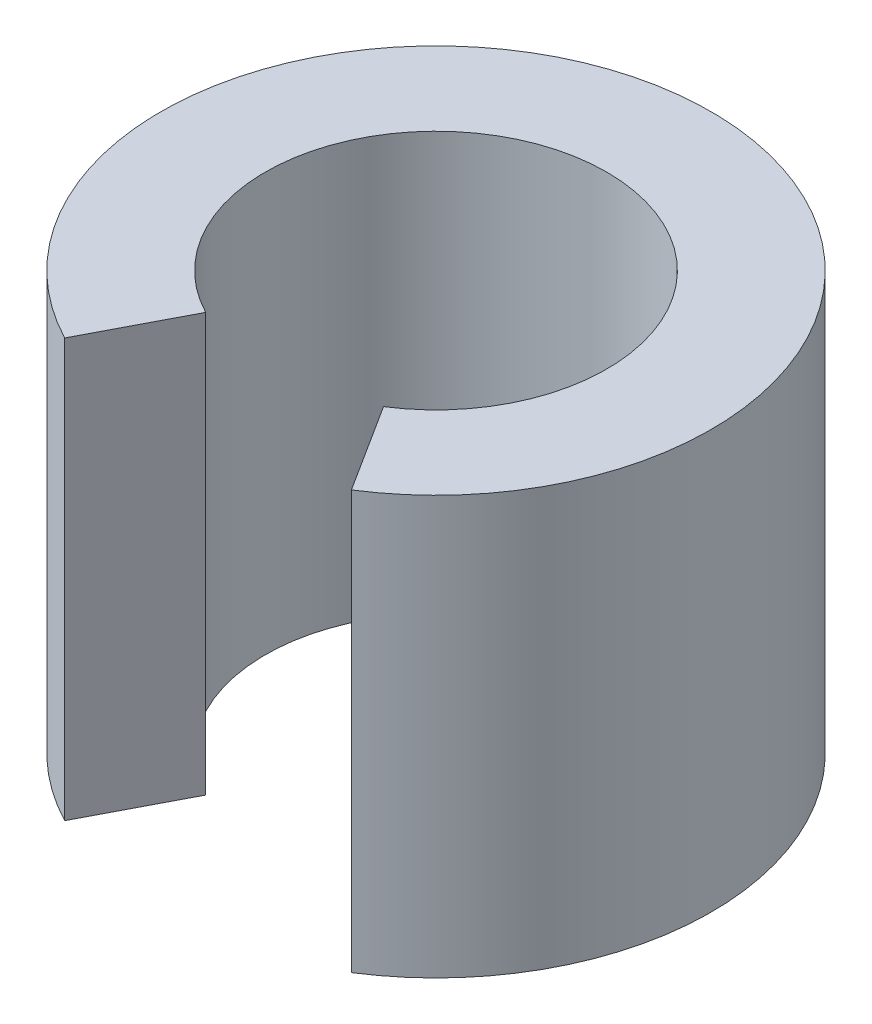
ISO-10303-21;
HEADER;
FILE_DESCRIPTION(('STEP AP214'),'2;1');
FILE_NAME('part.step','',(''),(''),'','','');
FILE_SCHEMA(('AUTOMOTIVE_DESIGN { 1 0 10303 214 1 1 1 1 }'));
ENDSEC;
DATA;
#1=APPLICATION_CONTEXT('core data for automotive mechanical design processes');
#2=APPLICATION_PROTOCOL_DEFINITION('international standard','automotive_design',2000,#1);
#3=PRODUCT_CONTEXT('',#1,'mechanical');
#4=PRODUCT('Part','Part','',(#3));
#5=PRODUCT_RELATED_PRODUCT_CATEGORY('part','',(#4));
#6=PRODUCT_DEFINITION_FORMATION('','',#4);
#7=PRODUCT_DEFINITION_CONTEXT('part definition',#1,'design');
#8=PRODUCT_DEFINITION('design','',#6,#7);
#9=PRODUCT_DEFINITION_SHAPE('','',#8);
#10=(LENGTH_UNIT() NAMED_UNIT(*) SI_UNIT(.MILLI.,.METRE.));
#11=(NAMED_UNIT(*) PLANE_ANGLE_UNIT() SI_UNIT($,.RADIAN.));
#12=(NAMED_UNIT(*) SI_UNIT($,.STERADIAN.) SOLID_ANGLE_UNIT());
#13=UNCERTAINTY_MEASURE_WITH_UNIT(LENGTH_MEASURE(1.E-05),#10,'distance_accuracy_value','');
#14=(GEOMETRIC_REPRESENTATION_CONTEXT(3) GLOBAL_UNCERTAINTY_ASSIGNED_CONTEXT((#13)) GLOBAL_UNIT_ASSIGNED_CONTEXT((#10,
#11,#12)) REPRESENTATION_CONTEXT('',''));
#15=CARTESIAN_POINT('',(0.,0.,0.));
#16=DIRECTION('',(0.,0.,1.));
#17=DIRECTION('',(1.,0.,0.));
#18=AXIS2_PLACEMENT_3D('',#15,#16,#17);
#19=CARTESIAN_POINT('',(0.,6.,0.));
#20=DIRECTION('',(0.,-1.,0.));
#21=DIRECTION('',(0.,0.,-1.));
#22=AXIS2_PLACEMENT_3D('',#19,#20,#21);
#23=CYLINDRICAL_SURFACE('',#22,2.45);
#24=CARTESIAN_POINT('',(0.,0.,0.));
#25=DIRECTION('',(0.,-1.,0.));
#26=DIRECTION('',(0.,0.,-1.));
#27=AXIS2_PLACEMENT_3D('',#24,#25,#26);
#28=CIRCLE('',#27,2.45);
#29=CARTESIAN_POINT('',(-1.1332867164028,0.,2.17213287310536));
#30=VERTEX_POINT('',#29);
#31=CARTESIAN_POINT('',(1.3144788903031,0.,2.06752152272897));
#32=VERTEX_POINT('',#31);
#33=EDGE_CURVE('E96',#30,#32,#28,.T.);
#34=ORIENTED_EDGE('',*,*,#33,.T.);
#35=DIRECTION('',(0.,-1.,0.));
#36=VECTOR('',#35,1.);
#37=CARTESIAN_POINT('',(1.3144788903031,6.,2.06752152272897));
#38=LINE('',#37,#36);
#39=CARTESIAN_POINT('',(1.3144788903031,6.,2.06752152272897));
#40=VERTEX_POINT('',#39);
#41=EDGE_CURVE('E11',#40,#32,#38,.T.);
#42=ORIENTED_EDGE('',*,*,#41,.F.);
#43=CARTESIAN_POINT('',(0.,6.,0.));
#44=DIRECTION('',(0.,-1.,0.));
#45=DIRECTION('',(0.,0.,-1.));
#46=AXIS2_PLACEMENT_3D('',#43,#44,#45);
#47=CIRCLE('',#46,2.45);
#48=CARTESIAN_POINT('',(-1.1332867164028,6.,2.17213287310536));
#49=VERTEX_POINT('',#48);
#50=EDGE_CURVE('E84',#49,#40,#47,.T.);
#51=ORIENTED_EDGE('',*,*,#50,.F.);
#52=DIRECTION('',(0.,-1.,0.));
#53=VECTOR('',#52,1.);
#54=CARTESIAN_POINT('',(-1.1332867164028,6.,2.17213287310536));
#55=LINE('',#54,#53);
#56=EDGE_CURVE('E92',#49,#30,#55,.T.);
#57=ORIENTED_EDGE('',*,*,#56,.T.);
#58=EDGE_LOOP('',(#34,#42,#51,#57));
#59=FACE_BOUND('',#58,.T.);
#60=ADVANCED_FACE('F33',(#59),#23,.F.);
#61=CARTESIAN_POINT('',(1.3144788903031,6.,2.06752152272897));
#62=DIRECTION('',(0.843886335807745,0.,-0.53652199604208));
#63=DIRECTION('',(-0.53652199604208,0.,-0.843886335807745));
#64=AXIS2_PLACEMENT_3D('',#61,#62,#63);
#65=PLANE('',#64);
#66=DIRECTION('',(0.53652199604208,0.,0.843886335807745));
#67=VECTOR('',#66,1.);
#68=CARTESIAN_POINT('',(1.3144788903031,0.,2.06752152272897));
#69=LINE('',#68,#67);
#70=CARTESIAN_POINT('',(2.11926188436622,0.,3.33335102644059));
#71=VERTEX_POINT('',#70);
#72=EDGE_CURVE('E88',#32,#71,#69,.T.);
#73=ORIENTED_EDGE('',*,*,#72,.T.);
#74=DIRECTION('',(0.,-1.,0.));
#75=VECTOR('',#74,1.);
#76=CARTESIAN_POINT('',(2.11926188436622,6.,3.33335102644059));
#77=LINE('',#76,#75);
#78=CARTESIAN_POINT('',(2.11926188436622,6.,3.33335102644059));
#79=VERTEX_POINT('',#78);
#80=EDGE_CURVE('E41',#79,#71,#77,.T.);
#81=ORIENTED_EDGE('',*,*,#80,.F.);
#82=DIRECTION('',(0.53652199604208,0.,0.843886335807745));
#83=VECTOR('',#82,1.);
#84=CARTESIAN_POINT('',(1.3144788903031,6.,2.06752152272897));
#85=LINE('',#84,#83);
#86=EDGE_CURVE('E79',#40,#79,#85,.T.);
#87=ORIENTED_EDGE('',*,*,#86,.F.);
#88=ORIENTED_EDGE('',*,*,#41,.T.);
#89=EDGE_LOOP('',(#73,#81,#87,#88));
#90=FACE_BOUND('',#89,.T.);
#91=ADVANCED_FACE('F87',(#90),#65,.F.);
#92=CARTESIAN_POINT('',(0.,6.,0.));
#93=DIRECTION('',(0.,-1.,0.));
#94=DIRECTION('',(0.,0.,-1.));
#95=AXIS2_PLACEMENT_3D('',#92,#93,#94);
#96=CYLINDRICAL_SURFACE('',#95,3.95);
#97=CARTESIAN_POINT('',(0.,0.,0.));
#98=DIRECTION('',(0.,1.,0.));
#99=DIRECTION('',(0.,0.,-1.));
#100=AXIS2_PLACEMENT_3D('',#97,#98,#99);
#101=CIRCLE('',#100,3.95);
#102=CARTESIAN_POINT('',(-1.82713572644533,0.,3.50201014235354));
#103=VERTEX_POINT('',#102);
#104=EDGE_CURVE('E66',#71,#103,#101,.T.);
#105=ORIENTED_EDGE('',*,*,#104,.T.);
#106=DIRECTION('',(0.,-1.,0.));
#107=VECTOR('',#106,1.);
#108=CARTESIAN_POINT('',(-1.82713572644533,6.,3.50201014235354));
#109=LINE('',#108,#107);
#110=CARTESIAN_POINT('',(-1.82713572644533,6.,3.50201014235354));
#111=VERTEX_POINT('',#110);
#112=EDGE_CURVE('E89',#111,#103,#109,.T.);
#113=ORIENTED_EDGE('',*,*,#112,.F.);
#114=CARTESIAN_POINT('',(0.,6.,0.));
#115=DIRECTION('',(0.,1.,0.));
#116=DIRECTION('',(0.,0.,-1.));
#117=AXIS2_PLACEMENT_3D('',#114,#115,#116);
#118=CIRCLE('',#117,3.95);
#119=EDGE_CURVE('E82',#79,#111,#118,.T.);
#120=ORIENTED_EDGE('',*,*,#119,.F.);
#121=ORIENTED_EDGE('',*,*,#80,.T.);
#122=EDGE_LOOP('',(#105,#113,#120,#121));
#123=FACE_BOUND('',#122,.T.);
#124=ADVANCED_FACE('F90',(#123),#96,.T.);
#125=CARTESIAN_POINT('',(-1.1332867164028,6.,2.17213287310536));
#126=DIRECTION('',(-0.886584846165454,0.,-0.46256600669502));
#127=DIRECTION('',(-0.46256600669502,0.,0.886584846165454));
#128=AXIS2_PLACEMENT_3D('',#125,#126,#127);
#129=PLANE('',#128);
#130=DIRECTION('',(0.46256600669502,0.,-0.886584846165454));
#131=VECTOR('',#130,1.);
#132=CARTESIAN_POINT('',(-1.1332867164028,0.,2.17213287310536));
#133=LINE('',#132,#131);
#134=EDGE_CURVE('E72',#103,#30,#133,.T.);
#135=ORIENTED_EDGE('',*,*,#134,.T.);
#136=ORIENTED_EDGE('',*,*,#56,.F.);
#137=DIRECTION('',(0.46256600669502,0.,-0.886584846165454));
#138=VECTOR('',#137,1.);
#139=CARTESIAN_POINT('',(-1.1332867164028,6.,2.17213287310536));
#140=LINE('',#139,#138);
#141=EDGE_CURVE('E49',#111,#49,#140,.T.);
#142=ORIENTED_EDGE('',*,*,#141,.F.);
#143=ORIENTED_EDGE('',*,*,#112,.T.);
#144=EDGE_LOOP('',(#135,#136,#142,#143));
#145=FACE_BOUND('',#144,.T.);
#146=ADVANCED_FACE('F103',(#145),#129,.F.);
#147=CARTESIAN_POINT('',(0.,6.,0.));
#148=DIRECTION('',(0.,-1.,0.));
#149=DIRECTION('',(0.,0.,-1.));
#150=AXIS2_PLACEMENT_3D('',#147,#148,#149);
#151=PLANE('',#150);
#152=ORIENTED_EDGE('',*,*,#50,.T.);
#153=ORIENTED_EDGE('',*,*,#86,.T.);
#154=ORIENTED_EDGE('',*,*,#119,.T.);
#155=ORIENTED_EDGE('',*,*,#141,.T.);
#156=EDGE_LOOP('',(#152,#153,#154,#155));
#157=FACE_BOUND('',#156,.T.);
#158=ADVANCED_FACE('F80',(#157),#151,.F.);
#159=CARTESIAN_POINT('',(0.,0.,0.));
#160=DIRECTION('',(0.,-1.,0.));
#161=DIRECTION('',(0.,0.,-1.));
#162=AXIS2_PLACEMENT_3D('',#159,#160,#161);
#163=PLANE('',#162);
#164=ORIENTED_EDGE('',*,*,#33,.F.);
#165=ORIENTED_EDGE('',*,*,#134,.F.);
#166=ORIENTED_EDGE('',*,*,#104,.F.);
#167=ORIENTED_EDGE('',*,*,#72,.F.);
#168=EDGE_LOOP('',(#164,#165,#166,#167));
#169=FACE_BOUND('',#168,.T.);
#170=ADVANCED_FACE('F106',(#169),#163,.T.);
#171=CLOSED_SHELL('',(#60,#91,#124,#146,#158,#170));
#172=MANIFOLD_SOLID_BREP('B2',#171);
#173=ADVANCED_BREP_SHAPE_REPRESENTATION('',(#18,#172),#14);
#174=SHAPE_DEFINITION_REPRESENTATION(#9,#173);
ENDSEC;
END-ISO-10303-21;
